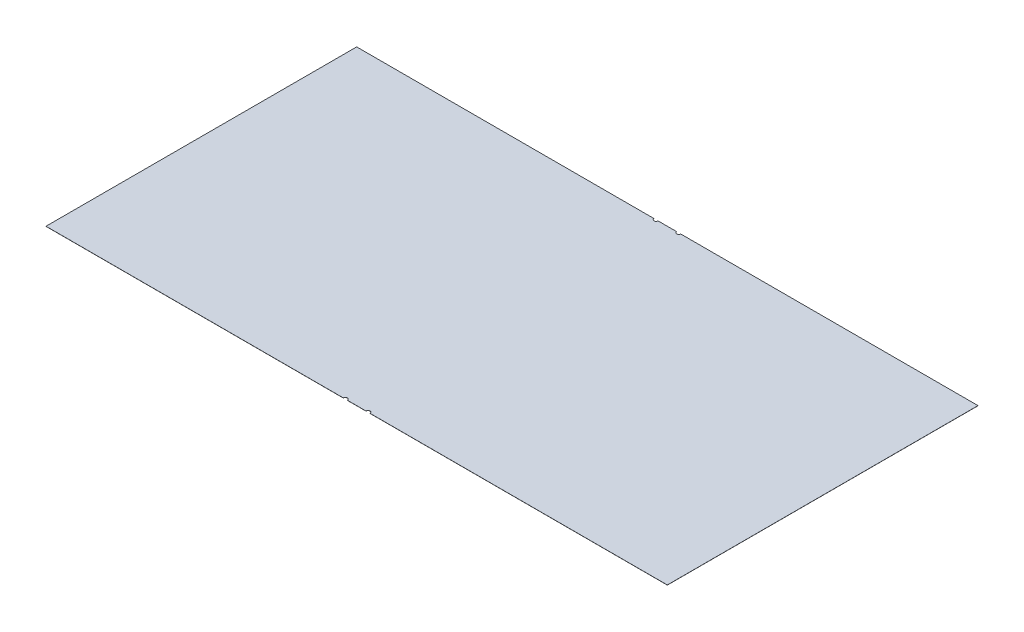
ISO-10303-21;
HEADER;
FILE_DESCRIPTION(('STEP AP214'),'2;1');
FILE_NAME('part.step','',(''),(''),'','','');
FILE_SCHEMA(('AUTOMOTIVE_DESIGN { 1 0 10303 214 1 1 1 1 }'));
ENDSEC;
DATA;
#1=APPLICATION_CONTEXT('core data for automotive mechanical design processes');
#2=APPLICATION_PROTOCOL_DEFINITION('international standard','automotive_design',2000,#1);
#3=PRODUCT_CONTEXT('',#1,'mechanical');
#4=PRODUCT('Part','Part','',(#3));
#5=PRODUCT_RELATED_PRODUCT_CATEGORY('part','',(#4));
#6=PRODUCT_DEFINITION_FORMATION('','',#4);
#7=PRODUCT_DEFINITION_CONTEXT('part definition',#1,'design');
#8=PRODUCT_DEFINITION('design','',#6,#7);
#9=PRODUCT_DEFINITION_SHAPE('','',#8);
#10=(LENGTH_UNIT() NAMED_UNIT(*) SI_UNIT(.MILLI.,.METRE.));
#11=(NAMED_UNIT(*) PLANE_ANGLE_UNIT() SI_UNIT($,.RADIAN.));
#12=(NAMED_UNIT(*) SI_UNIT($,.STERADIAN.) SOLID_ANGLE_UNIT());
#13=UNCERTAINTY_MEASURE_WITH_UNIT(LENGTH_MEASURE(1.E-05),#10,'distance_accuracy_value','');
#14=(GEOMETRIC_REPRESENTATION_CONTEXT(3) GLOBAL_UNCERTAINTY_ASSIGNED_CONTEXT((#13)) GLOBAL_UNIT_ASSIGNED_CONTEXT((#10,
#11,#12)) REPRESENTATION_CONTEXT('',''));
#15=CARTESIAN_POINT('',(0.,0.,0.));
#16=DIRECTION('',(0.,0.,1.));
#17=DIRECTION('',(1.,0.,0.));
#18=AXIS2_PLACEMENT_3D('',#15,#16,#17);
#19=CARTESIAN_POINT('',(609.6,3.175,609.6));
#20=DIRECTION('',(-1.,0.,0.));
#21=DIRECTION('',(0.,0.,1.));
#22=AXIS2_PLACEMENT_3D('',#19,#20,#21);
#23=PLANE('',#22);
#24=DIRECTION('',(0.,0.,-1.));
#25=VECTOR('',#24,1.);
#26=CARTESIAN_POINT('',(609.6,3.175,609.6));
#27=LINE('',#26,#25);
#28=CARTESIAN_POINT('',(609.6,3.175,304.8));
#29=VERTEX_POINT('',#28);
#30=CARTESIAN_POINT('',(609.6,3.175,-304.8));
#31=VERTEX_POINT('',#30);
#32=EDGE_CURVE('E160',#29,#31,#27,.T.);
#33=ORIENTED_EDGE('',*,*,#32,.F.);
#34=DIRECTION('',(0.,-1.,0.));
#35=VECTOR('',#34,1.);
#36=CARTESIAN_POINT('',(609.6,3.175,304.8));
#37=LINE('',#36,#35);
#38=CARTESIAN_POINT('',(609.6,2.921,304.8));
#39=VERTEX_POINT('',#38);
#40=EDGE_CURVE('E152',#29,#39,#37,.T.);
#41=ORIENTED_EDGE('',*,*,#40,.T.);
#42=DIRECTION('',(0.,0.,-1.));
#43=VECTOR('',#42,1.);
#44=CARTESIAN_POINT('',(609.6,2.92099999999995,-571.499999999999));
#45=LINE('',#44,#43);
#46=CARTESIAN_POINT('',(609.6,2.92099999999995,-304.8));
#47=VERTEX_POINT('',#46);
#48=EDGE_CURVE('E199',#39,#47,#45,.T.);
#49=ORIENTED_EDGE('',*,*,#48,.T.);
#50=DIRECTION('',(0.,-1.,0.));
#51=VECTOR('',#50,1.);
#52=CARTESIAN_POINT('',(609.6,3.175,-304.8));
#53=LINE('',#52,#51);
#54=EDGE_CURVE('E231',#31,#47,#53,.T.);
#55=ORIENTED_EDGE('',*,*,#54,.F.);
#56=EDGE_LOOP('',(#33,#41,#49,#55));
#57=FACE_BOUND('',#56,.T.);
#58=ADVANCED_FACE('F41',(#57),#23,.F.);
#59=CARTESIAN_POINT('',(-609.6,3.175,609.6));
#60=DIRECTION('',(1.,0.,0.));
#61=DIRECTION('',(0.,0.,-1.));
#62=AXIS2_PLACEMENT_3D('',#59,#60,#61);
#63=PLANE('',#62);
#64=DIRECTION('',(0.,0.,1.));
#65=VECTOR('',#64,1.);
#66=CARTESIAN_POINT('',(-609.6,2.92099999999995,571.499999999999));
#67=LINE('',#66,#65);
#68=CARTESIAN_POINT('',(-609.6,2.921,-304.8));
#69=VERTEX_POINT('',#68);
#70=CARTESIAN_POINT('',(-609.6,2.92099999999995,304.8));
#71=VERTEX_POINT('',#70);
#72=EDGE_CURVE('E150',#69,#71,#67,.T.);
#73=ORIENTED_EDGE('',*,*,#72,.T.);
#74=DIRECTION('',(0.,-1.,0.));
#75=VECTOR('',#74,1.);
#76=CARTESIAN_POINT('',(-609.6,3.175,304.8));
#77=LINE('',#76,#75);
#78=CARTESIAN_POINT('',(-609.6,3.175,304.8));
#79=VERTEX_POINT('',#78);
#80=EDGE_CURVE('E131',#79,#71,#77,.T.);
#81=ORIENTED_EDGE('',*,*,#80,.F.);
#82=DIRECTION('',(0.,0.,1.));
#83=VECTOR('',#82,1.);
#84=CARTESIAN_POINT('',(-609.6,3.175,609.6));
#85=LINE('',#84,#83);
#86=CARTESIAN_POINT('',(-609.6,3.175,-304.8));
#87=VERTEX_POINT('',#86);
#88=EDGE_CURVE('E148',#87,#79,#85,.T.);
#89=ORIENTED_EDGE('',*,*,#88,.F.);
#90=DIRECTION('',(0.,-1.,0.));
#91=VECTOR('',#90,1.);
#92=CARTESIAN_POINT('',(-609.6,3.175,-304.8));
#93=LINE('',#92,#91);
#94=EDGE_CURVE('E234',#87,#69,#93,.T.);
#95=ORIENTED_EDGE('',*,*,#94,.T.);
#96=EDGE_LOOP('',(#73,#81,#89,#95));
#97=FACE_BOUND('',#96,.T.);
#98=ADVANCED_FACE('F146',(#97),#63,.F.);
#99=CARTESIAN_POINT('',(22.2250000000001,3.175,304.8));
#100=DIRECTION('',(0.,1.,0.));
#101=DIRECTION('',(0.,0.,1.));
#102=AXIS2_PLACEMENT_3D('',#99,#100,#101);
#103=CYLINDRICAL_SURFACE('',#102,3.96875);
#104=CARTESIAN_POINT('',(22.2250000000001,3.175,304.8));
#105=DIRECTION('',(0.,1.,0.));
#106=DIRECTION('',(0.,0.,1.));
#107=AXIS2_PLACEMENT_3D('',#104,#105,#106);
#108=CIRCLE('',#107,3.96875);
#109=CARTESIAN_POINT('',(26.1937500000001,3.175,304.8));
#110=VERTEX_POINT('',#109);
#111=CARTESIAN_POINT('',(18.2562500000001,3.175,304.8));
#112=VERTEX_POINT('',#111);
#113=EDGE_CURVE('E167',#110,#112,#108,.T.);
#114=ORIENTED_EDGE('',*,*,#113,.T.);
#115=DIRECTION('',(0.,1.,0.));
#116=VECTOR('',#115,1.);
#117=CARTESIAN_POINT('',(18.2562500000001,3.175,304.8));
#118=LINE('',#117,#116);
#119=CARTESIAN_POINT('',(18.2562500000001,2.921,304.8));
#120=VERTEX_POINT('',#119);
#121=EDGE_CURVE('E205',#112,#120,#118,.F.);
#122=ORIENTED_EDGE('',*,*,#121,.T.);
#123=CARTESIAN_POINT('',(22.2250000000001,2.921,304.8));
#124=DIRECTION('',(0.,-1.,0.));
#125=DIRECTION('',(0.,0.,-1.));
#126=AXIS2_PLACEMENT_3D('',#123,#124,#125);
#127=CIRCLE('',#126,3.96875);
#128=CARTESIAN_POINT('',(26.1937500000001,2.921,304.8));
#129=VERTEX_POINT('',#128);
#130=EDGE_CURVE('E183',#129,#120,#127,.F.);
#131=ORIENTED_EDGE('',*,*,#130,.F.);
#132=DIRECTION('',(0.,1.,0.));
#133=VECTOR('',#132,1.);
#134=CARTESIAN_POINT('',(26.1937500000001,3.175,304.8));
#135=LINE('',#134,#133);
#136=EDGE_CURVE('E56',#129,#110,#135,.T.);
#137=ORIENTED_EDGE('',*,*,#136,.T.);
#138=EDGE_LOOP('',(#114,#122,#131,#137));
#139=FACE_BOUND('',#138,.T.);
#140=ADVANCED_FACE('F257',(#139),#103,.F.);
#141=CARTESIAN_POINT('',(-22.225,3.175,304.8));
#142=DIRECTION('',(0.,1.,0.));
#143=DIRECTION('',(0.,0.,1.));
#144=AXIS2_PLACEMENT_3D('',#141,#142,#143);
#145=CYLINDRICAL_SURFACE('',#144,3.96875);
#146=CARTESIAN_POINT('',(-22.225,3.175,304.8));
#147=DIRECTION('',(0.,1.,0.));
#148=DIRECTION('',(0.,0.,1.));
#149=AXIS2_PLACEMENT_3D('',#146,#147,#148);
#150=CIRCLE('',#149,3.96875);
#151=CARTESIAN_POINT('',(-18.25625,3.175,304.8));
#152=VERTEX_POINT('',#151);
#153=CARTESIAN_POINT('',(-26.19375,3.175,304.8));
#154=VERTEX_POINT('',#153);
#155=EDGE_CURVE('E172',#152,#154,#150,.T.);
#156=ORIENTED_EDGE('',*,*,#155,.T.);
#157=DIRECTION('',(0.,1.,0.));
#158=VECTOR('',#157,1.);
#159=CARTESIAN_POINT('',(-26.19375,3.175,304.8));
#160=LINE('',#159,#158);
#161=CARTESIAN_POINT('',(-26.19375,2.921,304.8));
#162=VERTEX_POINT('',#161);
#163=EDGE_CURVE('E134',#154,#162,#160,.F.);
#164=ORIENTED_EDGE('',*,*,#163,.T.);
#165=CARTESIAN_POINT('',(-22.225,2.921,304.8));
#166=DIRECTION('',(0.,-1.,0.));
#167=DIRECTION('',(0.,0.,-1.));
#168=AXIS2_PLACEMENT_3D('',#165,#166,#167);
#169=CIRCLE('',#168,3.96875);
#170=CARTESIAN_POINT('',(-18.25625,2.921,304.8));
#171=VERTEX_POINT('',#170);
#172=EDGE_CURVE('E187',#171,#162,#169,.F.);
#173=ORIENTED_EDGE('',*,*,#172,.F.);
#174=DIRECTION('',(0.,1.,0.));
#175=VECTOR('',#174,1.);
#176=CARTESIAN_POINT('',(-18.25625,3.175,304.8));
#177=LINE('',#176,#175);
#178=EDGE_CURVE('E63',#171,#152,#177,.T.);
#179=ORIENTED_EDGE('',*,*,#178,.T.);
#180=EDGE_LOOP('',(#156,#164,#173,#179));
#181=FACE_BOUND('',#180,.T.);
#182=ADVANCED_FACE('F303',(#181),#145,.F.);
#183=CARTESIAN_POINT('',(22.2250000000001,3.175,-304.8));
#184=DIRECTION('',(0.,1.,0.));
#185=DIRECTION('',(0.,0.,1.));
#186=AXIS2_PLACEMENT_3D('',#183,#184,#185);
#187=CYLINDRICAL_SURFACE('',#186,3.96875);
#188=CARTESIAN_POINT('',(22.2250000000001,3.175,-304.8));
#189=DIRECTION('',(0.,1.,0.));
#190=DIRECTION('',(0.,0.,1.));
#191=AXIS2_PLACEMENT_3D('',#188,#189,#190);
#192=CIRCLE('',#191,3.96875);
#193=CARTESIAN_POINT('',(18.2562500000001,3.175,-304.8));
#194=VERTEX_POINT('',#193);
#195=CARTESIAN_POINT('',(26.19375,3.175,-304.8));
#196=VERTEX_POINT('',#195);
#197=EDGE_CURVE('E175',#194,#196,#192,.T.);
#198=ORIENTED_EDGE('',*,*,#197,.T.);
#199=DIRECTION('',(0.,1.,0.));
#200=VECTOR('',#199,1.);
#201=CARTESIAN_POINT('',(26.1937500000001,3.175,-304.8));
#202=LINE('',#201,#200);
#203=CARTESIAN_POINT('',(26.19375,2.921,-304.8));
#204=VERTEX_POINT('',#203);
#205=EDGE_CURVE('E215',#196,#204,#202,.F.);
#206=ORIENTED_EDGE('',*,*,#205,.T.);
#207=CARTESIAN_POINT('',(22.2250000000001,2.921,-304.8));
#208=DIRECTION('',(0.,-1.,0.));
#209=DIRECTION('',(0.,0.,-1.));
#210=AXIS2_PLACEMENT_3D('',#207,#208,#209);
#211=CIRCLE('',#210,3.96875);
#212=CARTESIAN_POINT('',(18.2562500000001,2.921,-304.8));
#213=VERTEX_POINT('',#212);
#214=EDGE_CURVE('E191',#213,#204,#211,.F.);
#215=ORIENTED_EDGE('',*,*,#214,.F.);
#216=DIRECTION('',(0.,1.,0.));
#217=VECTOR('',#216,1.);
#218=CARTESIAN_POINT('',(18.2562500000001,3.175,-304.8));
#219=LINE('',#218,#217);
#220=EDGE_CURVE('E219',#213,#194,#219,.T.);
#221=ORIENTED_EDGE('',*,*,#220,.T.);
#222=EDGE_LOOP('',(#198,#206,#215,#221));
#223=FACE_BOUND('',#222,.T.);
#224=ADVANCED_FACE('F281',(#223),#187,.F.);
#225=CARTESIAN_POINT('',(-22.2250000000001,3.175,-304.8));
#226=DIRECTION('',(0.,1.,0.));
#227=DIRECTION('',(0.,0.,1.));
#228=AXIS2_PLACEMENT_3D('',#225,#226,#227);
#229=CYLINDRICAL_SURFACE('',#228,3.96875);
#230=CARTESIAN_POINT('',(-22.2250000000001,3.175,-304.8));
#231=DIRECTION('',(0.,1.,0.));
#232=DIRECTION('',(0.,0.,1.));
#233=AXIS2_PLACEMENT_3D('',#230,#231,#232);
#234=CIRCLE('',#233,3.96875);
#235=CARTESIAN_POINT('',(-26.19375,3.175,-304.8));
#236=VERTEX_POINT('',#235);
#237=CARTESIAN_POINT('',(-18.2562500000001,3.175,-304.8));
#238=VERTEX_POINT('',#237);
#239=EDGE_CURVE('E179',#236,#238,#234,.T.);
#240=ORIENTED_EDGE('',*,*,#239,.T.);
#241=DIRECTION('',(0.,1.,0.));
#242=VECTOR('',#241,1.);
#243=CARTESIAN_POINT('',(-18.2562500000001,3.175,-304.8));
#244=LINE('',#243,#242);
#245=CARTESIAN_POINT('',(-18.2562500000001,2.921,-304.8));
#246=VERTEX_POINT('',#245);
#247=EDGE_CURVE('E223',#238,#246,#244,.F.);
#248=ORIENTED_EDGE('',*,*,#247,.T.);
#249=CARTESIAN_POINT('',(-22.2250000000001,2.921,-304.8));
#250=DIRECTION('',(0.,-1.,0.));
#251=DIRECTION('',(0.,0.,-1.));
#252=AXIS2_PLACEMENT_3D('',#249,#250,#251);
#253=CIRCLE('',#252,3.96875);
#254=CARTESIAN_POINT('',(-26.1937500000001,2.921,-304.8));
#255=VERTEX_POINT('',#254);
#256=EDGE_CURVE('E195',#255,#246,#253,.F.);
#257=ORIENTED_EDGE('',*,*,#256,.F.);
#258=DIRECTION('',(0.,1.,0.));
#259=VECTOR('',#258,1.);
#260=CARTESIAN_POINT('',(-26.1937500000001,3.175,-304.8));
#261=LINE('',#260,#259);
#262=EDGE_CURVE('E227',#255,#236,#261,.T.);
#263=ORIENTED_EDGE('',*,*,#262,.T.);
#264=EDGE_LOOP('',(#240,#248,#257,#263));
#265=FACE_BOUND('',#264,.T.);
#266=ADVANCED_FACE('F273',(#265),#229,.F.);
#267=CARTESIAN_POINT('',(0.,3.175,0.));
#268=DIRECTION('',(0.,-1.,0.));
#269=DIRECTION('',(0.,0.,-1.));
#270=AXIS2_PLACEMENT_3D('',#267,#268,#269);
#271=PLANE('',#270);
#272=ORIENTED_EDGE('',*,*,#88,.T.);
#273=DIRECTION('',(1.,0.,0.));
#274=VECTOR('',#273,1.);
#275=CARTESIAN_POINT('',(609.6,3.175,304.8));
#276=LINE('',#275,#274);
#277=EDGE_CURVE('E128',#79,#154,#276,.T.);
#278=ORIENTED_EDGE('',*,*,#277,.T.);
#279=ORIENTED_EDGE('',*,*,#155,.F.);
#280=EDGE_CURVE('E140',#152,#112,#276,.T.);
#281=ORIENTED_EDGE('',*,*,#280,.T.);
#282=ORIENTED_EDGE('',*,*,#113,.F.);
#283=EDGE_CURVE('E142',#110,#29,#276,.T.);
#284=ORIENTED_EDGE('',*,*,#283,.T.);
#285=ORIENTED_EDGE('',*,*,#32,.T.);
#286=DIRECTION('',(-1.,0.,0.));
#287=VECTOR('',#286,1.);
#288=CARTESIAN_POINT('',(609.6,3.175,-304.8));
#289=LINE('',#288,#287);
#290=EDGE_CURVE('E235',#31,#196,#289,.T.);
#291=ORIENTED_EDGE('',*,*,#290,.T.);
#292=ORIENTED_EDGE('',*,*,#197,.F.);
#293=EDGE_CURVE('E244',#194,#238,#289,.T.);
#294=ORIENTED_EDGE('',*,*,#293,.T.);
#295=ORIENTED_EDGE('',*,*,#239,.F.);
#296=EDGE_CURVE('E157',#236,#87,#289,.T.);
#297=ORIENTED_EDGE('',*,*,#296,.T.);
#298=EDGE_LOOP('',(#272,#278,#279,#281,#282,#284,#285,#291,#292,#294,#295,#297));
#299=FACE_BOUND('',#298,.T.);
#300=ADVANCED_FACE('F155',(#299),#271,.F.);
#301=CARTESIAN_POINT('',(0.,2.921,0.));
#302=DIRECTION('',(0.,-1.,0.));
#303=DIRECTION('',(0.,0.,-1.));
#304=AXIS2_PLACEMENT_3D('',#301,#302,#303);
#305=PLANE('',#304);
#306=DIRECTION('',(1.,0.,0.));
#307=VECTOR('',#306,1.);
#308=CARTESIAN_POINT('',(609.6,2.921,304.8));
#309=LINE('',#308,#307);
#310=EDGE_CURVE('E238',#71,#162,#309,.T.);
#311=ORIENTED_EDGE('',*,*,#310,.F.);
#312=ORIENTED_EDGE('',*,*,#72,.F.);
#313=DIRECTION('',(-1.,0.,0.));
#314=VECTOR('',#313,1.);
#315=CARTESIAN_POINT('',(0.,2.921,-304.8));
#316=LINE('',#315,#314);
#317=EDGE_CURVE('E159',#255,#69,#316,.T.);
#318=ORIENTED_EDGE('',*,*,#317,.F.);
#319=ORIENTED_EDGE('',*,*,#256,.T.);
#320=EDGE_CURVE('E164',#213,#246,#316,.T.);
#321=ORIENTED_EDGE('',*,*,#320,.F.);
#322=ORIENTED_EDGE('',*,*,#214,.T.);
#323=DIRECTION('',(-1.,0.,0.));
#324=VECTOR('',#323,1.);
#325=CARTESIAN_POINT('',(609.6,2.921,-304.8));
#326=LINE('',#325,#324);
#327=EDGE_CURVE('E239',#47,#204,#326,.T.);
#328=ORIENTED_EDGE('',*,*,#327,.F.);
#329=ORIENTED_EDGE('',*,*,#48,.F.);
#330=DIRECTION('',(1.,0.,0.));
#331=VECTOR('',#330,1.);
#332=CARTESIAN_POINT('',(0.,2.921,304.8));
#333=LINE('',#332,#331);
#334=EDGE_CURVE('E44',#129,#39,#333,.T.);
#335=ORIENTED_EDGE('',*,*,#334,.F.);
#336=ORIENTED_EDGE('',*,*,#130,.T.);
#337=EDGE_CURVE('E12',#171,#120,#333,.T.);
#338=ORIENTED_EDGE('',*,*,#337,.F.);
#339=ORIENTED_EDGE('',*,*,#172,.T.);
#340=EDGE_LOOP('',(#311,#312,#318,#319,#321,#322,#328,#329,#335,#336,#338,#339));
#341=FACE_BOUND('',#340,.T.);
#342=ADVANCED_FACE('F260',(#341),#305,.T.);
#343=CARTESIAN_POINT('',(609.6,3.175,-304.8));
#344=DIRECTION('',(0.,0.,1.));
#345=DIRECTION('',(1.,0.,0.));
#346=AXIS2_PLACEMENT_3D('',#343,#344,#345);
#347=PLANE('',#346);
#348=ORIENTED_EDGE('',*,*,#317,.T.);
#349=ORIENTED_EDGE('',*,*,#94,.F.);
#350=ORIENTED_EDGE('',*,*,#296,.F.);
#351=ORIENTED_EDGE('',*,*,#262,.F.);
#352=EDGE_LOOP('',(#348,#349,#350,#351));
#353=FACE_BOUND('',#352,.T.);
#354=ADVANCED_FACE('F276',(#353),#347,.F.);
#355=ORIENTED_EDGE('',*,*,#320,.T.);
#356=ORIENTED_EDGE('',*,*,#247,.F.);
#357=ORIENTED_EDGE('',*,*,#293,.F.);
#358=ORIENTED_EDGE('',*,*,#220,.F.);
#359=EDGE_LOOP('',(#355,#356,#357,#358));
#360=FACE_BOUND('',#359,.T.);
#361=ADVANCED_FACE('F268',(#360),#347,.F.);
#362=ORIENTED_EDGE('',*,*,#290,.F.);
#363=ORIENTED_EDGE('',*,*,#54,.T.);
#364=ORIENTED_EDGE('',*,*,#327,.T.);
#365=ORIENTED_EDGE('',*,*,#205,.F.);
#366=EDGE_LOOP('',(#362,#363,#364,#365));
#367=FACE_BOUND('',#366,.T.);
#368=ADVANCED_FACE('F288',(#367),#347,.F.);
#369=CARTESIAN_POINT('',(609.6,3.175,304.8));
#370=DIRECTION('',(0.,0.,-1.));
#371=DIRECTION('',(-1.,0.,0.));
#372=AXIS2_PLACEMENT_3D('',#369,#370,#371);
#373=PLANE('',#372);
#374=ORIENTED_EDGE('',*,*,#334,.T.);
#375=ORIENTED_EDGE('',*,*,#40,.F.);
#376=ORIENTED_EDGE('',*,*,#283,.F.);
#377=ORIENTED_EDGE('',*,*,#136,.F.);
#378=EDGE_LOOP('',(#374,#375,#376,#377));
#379=FACE_BOUND('',#378,.T.);
#380=ADVANCED_FACE('F285',(#379),#373,.F.);
#381=ORIENTED_EDGE('',*,*,#280,.F.);
#382=ORIENTED_EDGE('',*,*,#178,.F.);
#383=ORIENTED_EDGE('',*,*,#337,.T.);
#384=ORIENTED_EDGE('',*,*,#121,.F.);
#385=EDGE_LOOP('',(#381,#382,#383,#384));
#386=FACE_BOUND('',#385,.T.);
#387=ADVANCED_FACE('F287',(#386),#373,.F.);
#388=ORIENTED_EDGE('',*,*,#277,.F.);
#389=ORIENTED_EDGE('',*,*,#80,.T.);
#390=ORIENTED_EDGE('',*,*,#310,.T.);
#391=ORIENTED_EDGE('',*,*,#163,.F.);
#392=EDGE_LOOP('',(#388,#389,#390,#391));
#393=FACE_BOUND('',#392,.T.);
#394=ADVANCED_FACE('F130',(#393),#373,.F.);
#395=CLOSED_SHELL('',(#58,#98,#140,#182,#224,#266,#300,#342,#354,#361,#368,#380,#387,#394));
#396=MANIFOLD_SOLID_BREP('B2',#395);
#397=ADVANCED_BREP_SHAPE_REPRESENTATION('',(#18,#396),#14);
#398=SHAPE_DEFINITION_REPRESENTATION(#9,#397);
ENDSEC;
END-ISO-10303-21;
